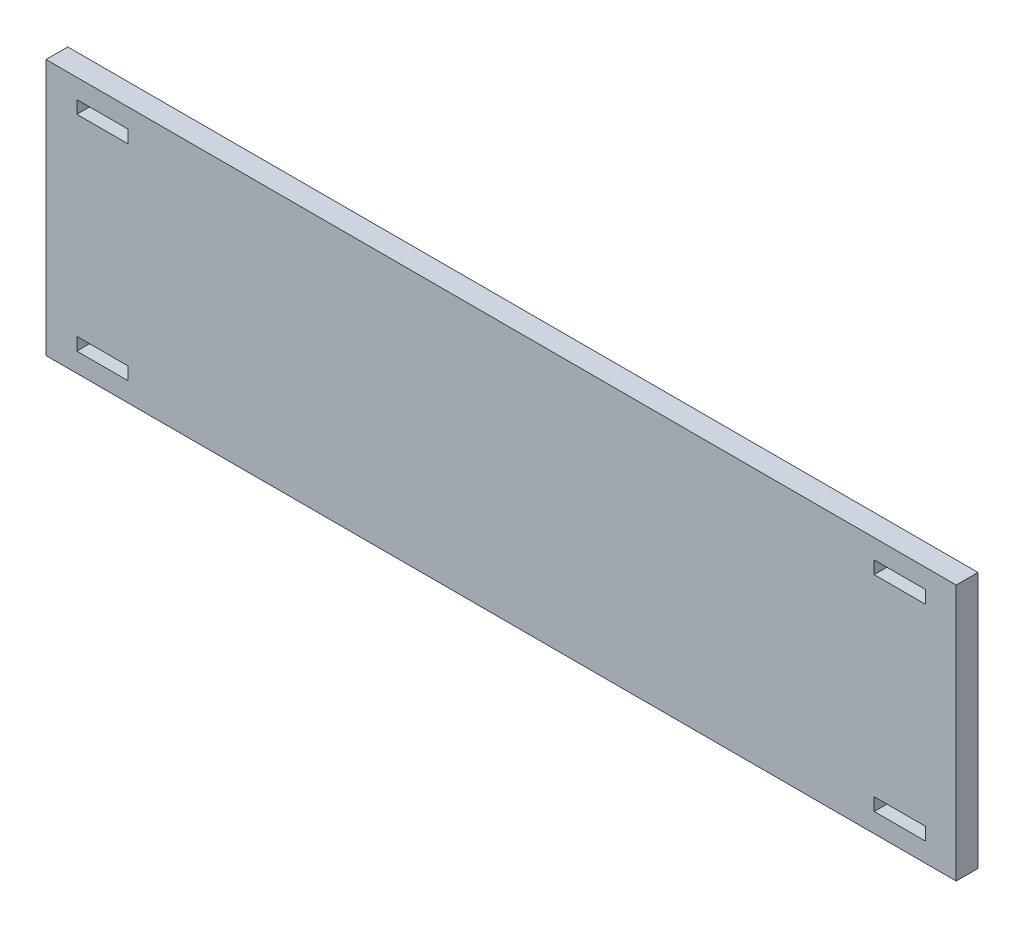
ISO-10303-21;
HEADER;
FILE_DESCRIPTION(('STEP AP214'),'2;1');
FILE_NAME('part.step','',(''),(''),'','','');
FILE_SCHEMA(('AUTOMOTIVE_DESIGN { 1 0 10303 214 1 1 1 1 }'));
ENDSEC;
DATA;
#1=APPLICATION_CONTEXT('core data for automotive mechanical design processes');
#2=APPLICATION_PROTOCOL_DEFINITION('international standard','automotive_design',2000,#1);
#3=PRODUCT_CONTEXT('',#1,'mechanical');
#4=PRODUCT('Part','Part','',(#3));
#5=PRODUCT_RELATED_PRODUCT_CATEGORY('part','',(#4));
#6=PRODUCT_DEFINITION_FORMATION('','',#4);
#7=PRODUCT_DEFINITION_CONTEXT('part definition',#1,'design');
#8=PRODUCT_DEFINITION('design','',#6,#7);
#9=PRODUCT_DEFINITION_SHAPE('','',#8);
#10=(LENGTH_UNIT() NAMED_UNIT(*) SI_UNIT(.MILLI.,.METRE.));
#11=(NAMED_UNIT(*) PLANE_ANGLE_UNIT() SI_UNIT($,.RADIAN.));
#12=(NAMED_UNIT(*) SI_UNIT($,.STERADIAN.) SOLID_ANGLE_UNIT());
#13=UNCERTAINTY_MEASURE_WITH_UNIT(LENGTH_MEASURE(1.E-05),#10,'distance_accuracy_value','');
#14=(GEOMETRIC_REPRESENTATION_CONTEXT(3) GLOBAL_UNCERTAINTY_ASSIGNED_CONTEXT((#13)) GLOBAL_UNIT_ASSIGNED_CONTEXT((#10,
#11,#12)) REPRESENTATION_CONTEXT('',''));
#15=CARTESIAN_POINT('',(0.,0.,0.));
#16=DIRECTION('',(0.,0.,1.));
#17=DIRECTION('',(1.,0.,0.));
#18=AXIS2_PLACEMENT_3D('',#15,#16,#17);
#19=CARTESIAN_POINT('',(177.5,50.,8.5));
#20=DIRECTION('',(-1.,0.,0.));
#21=DIRECTION('',(0.,0.,1.));
#22=AXIS2_PLACEMENT_3D('',#19,#20,#21);
#23=PLANE('',#22);
#24=DIRECTION('',(0.,1.,0.));
#25=VECTOR('',#24,1.);
#26=CARTESIAN_POINT('',(177.5,50.,0.));
#27=LINE('',#26,#25);
#28=CARTESIAN_POINT('',(177.5,-50.,0.));
#29=VERTEX_POINT('',#28);
#30=CARTESIAN_POINT('',(177.5,50.,0.));
#31=VERTEX_POINT('',#30);
#32=EDGE_CURVE('E347',#29,#31,#27,.T.);
#33=ORIENTED_EDGE('',*,*,#32,.T.);
#34=DIRECTION('',(0.,0.,-1.));
#35=VECTOR('',#34,1.);
#36=CARTESIAN_POINT('',(177.5,50.,8.5));
#37=LINE('',#36,#35);
#38=CARTESIAN_POINT('',(177.5,50.,8.5));
#39=VERTEX_POINT('',#38);
#40=EDGE_CURVE('E11',#39,#31,#37,.T.);
#41=ORIENTED_EDGE('',*,*,#40,.F.);
#42=DIRECTION('',(0.,1.,0.));
#43=VECTOR('',#42,1.);
#44=CARTESIAN_POINT('',(177.5,50.,8.5));
#45=LINE('',#44,#43);
#46=CARTESIAN_POINT('',(177.5,-50.,8.5));
#47=VERTEX_POINT('',#46);
#48=EDGE_CURVE('E357',#47,#39,#45,.T.);
#49=ORIENTED_EDGE('',*,*,#48,.F.);
#50=DIRECTION('',(0.,0.,-1.));
#51=VECTOR('',#50,1.);
#52=CARTESIAN_POINT('',(177.5,-50.,8.5));
#53=LINE('',#52,#51);
#54=EDGE_CURVE('E371',#47,#29,#53,.T.);
#55=ORIENTED_EDGE('',*,*,#54,.T.);
#56=EDGE_LOOP('',(#33,#41,#49,#55));
#57=FACE_BOUND('',#56,.T.);
#58=ADVANCED_FACE('F44',(#57),#23,.F.);
#59=CARTESIAN_POINT('',(-177.5,50.,8.5));
#60=DIRECTION('',(0.,-1.,0.));
#61=DIRECTION('',(1.,0.,0.));
#62=AXIS2_PLACEMENT_3D('',#59,#60,#61);
#63=PLANE('',#62);
#64=DIRECTION('',(-1.,0.,0.));
#65=VECTOR('',#64,1.);
#66=CARTESIAN_POINT('',(-177.5,50.,0.));
#67=LINE('',#66,#65);
#68=CARTESIAN_POINT('',(-177.5,50.,0.));
#69=VERTEX_POINT('',#68);
#70=EDGE_CURVE('E375',#31,#69,#67,.T.);
#71=ORIENTED_EDGE('',*,*,#70,.T.);
#72=DIRECTION('',(0.,0.,-1.));
#73=VECTOR('',#72,1.);
#74=CARTESIAN_POINT('',(-177.5,50.,8.5));
#75=LINE('',#74,#73);
#76=CARTESIAN_POINT('',(-177.5,50.,8.5));
#77=VERTEX_POINT('',#76);
#78=EDGE_CURVE('E52',#77,#69,#75,.T.);
#79=ORIENTED_EDGE('',*,*,#78,.F.);
#80=DIRECTION('',(-1.,0.,0.));
#81=VECTOR('',#80,1.);
#82=CARTESIAN_POINT('',(-177.5,50.,8.5));
#83=LINE('',#82,#81);
#84=EDGE_CURVE('E361',#39,#77,#83,.T.);
#85=ORIENTED_EDGE('',*,*,#84,.F.);
#86=ORIENTED_EDGE('',*,*,#40,.T.);
#87=EDGE_LOOP('',(#71,#79,#85,#86));
#88=FACE_BOUND('',#87,.T.);
#89=ADVANCED_FACE('F410',(#88),#63,.F.);
#90=CARTESIAN_POINT('',(-177.5,50.,8.5));
#91=DIRECTION('',(1.,0.,0.));
#92=DIRECTION('',(0.,0.,-1.));
#93=AXIS2_PLACEMENT_3D('',#90,#91,#92);
#94=PLANE('',#93);
#95=DIRECTION('',(0.,-1.,0.));
#96=VECTOR('',#95,1.);
#97=CARTESIAN_POINT('',(-177.5,50.,0.));
#98=LINE('',#97,#96);
#99=CARTESIAN_POINT('',(-177.5,-50.0000000000001,0.));
#100=VERTEX_POINT('',#99);
#101=EDGE_CURVE('E378',#69,#100,#98,.T.);
#102=ORIENTED_EDGE('',*,*,#101,.T.);
#103=DIRECTION('',(0.,0.,-1.));
#104=VECTOR('',#103,1.);
#105=CARTESIAN_POINT('',(-177.5,-50.0000000000001,8.5));
#106=LINE('',#105,#104);
#107=CARTESIAN_POINT('',(-177.5,-50.0000000000001,8.5));
#108=VERTEX_POINT('',#107);
#109=EDGE_CURVE('E386',#108,#100,#106,.T.);
#110=ORIENTED_EDGE('',*,*,#109,.F.);
#111=DIRECTION('',(0.,-1.,0.));
#112=VECTOR('',#111,1.);
#113=CARTESIAN_POINT('',(-177.5,50.,8.5));
#114=LINE('',#113,#112);
#115=EDGE_CURVE('E365',#77,#108,#114,.T.);
#116=ORIENTED_EDGE('',*,*,#115,.F.);
#117=ORIENTED_EDGE('',*,*,#78,.T.);
#118=EDGE_LOOP('',(#102,#110,#116,#117));
#119=FACE_BOUND('',#118,.T.);
#120=ADVANCED_FACE('F395',(#119),#94,.F.);
#121=CARTESIAN_POINT('',(-177.5,-50.0000000000001,8.5));
#122=DIRECTION('',(0.,1.,0.));
#123=DIRECTION('',(-1.,0.,0.));
#124=AXIS2_PLACEMENT_3D('',#121,#122,#123);
#125=PLANE('',#124);
#126=DIRECTION('',(1.,0.,0.));
#127=VECTOR('',#126,1.);
#128=CARTESIAN_POINT('',(-177.5,-50.0000000000001,0.));
#129=LINE('',#128,#127);
#130=EDGE_CURVE('E362',#100,#29,#129,.T.);
#131=ORIENTED_EDGE('',*,*,#130,.T.);
#132=ORIENTED_EDGE('',*,*,#54,.F.);
#133=DIRECTION('',(1.,0.,0.));
#134=VECTOR('',#133,1.);
#135=CARTESIAN_POINT('',(-177.5,-50.0000000000001,8.5));
#136=LINE('',#135,#134);
#137=EDGE_CURVE('E368',#108,#47,#136,.T.);
#138=ORIENTED_EDGE('',*,*,#137,.F.);
#139=ORIENTED_EDGE('',*,*,#109,.T.);
#140=EDGE_LOOP('',(#131,#132,#138,#139));
#141=FACE_BOUND('',#140,.T.);
#142=ADVANCED_FACE('F404',(#141),#125,.F.);
#143=CARTESIAN_POINT('',(0.,0.,8.5));
#144=DIRECTION('',(0.,0.,1.));
#145=DIRECTION('',(1.,0.,0.));
#146=AXIS2_PLACEMENT_3D('',#143,#144,#145);
#147=PLANE('',#146);
#148=DIRECTION('',(0.,1.,0.));
#149=VECTOR('',#148,1.);
#150=CARTESIAN_POINT('',(-145.5,-37.5,8.5));
#151=LINE('',#150,#149);
#152=CARTESIAN_POINT('',(-145.5,-42.5,8.5));
#153=VERTEX_POINT('',#152);
#154=CARTESIAN_POINT('',(-145.5,-37.5,8.5));
#155=VERTEX_POINT('',#154);
#156=EDGE_CURVE('E59',#153,#155,#151,.T.);
#157=ORIENTED_EDGE('',*,*,#156,.F.);
#158=DIRECTION('',(1.,0.,0.));
#159=VECTOR('',#158,1.);
#160=CARTESIAN_POINT('',(-165.5,-42.5,8.5));
#161=LINE('',#160,#159);
#162=CARTESIAN_POINT('',(-165.5,-42.5,8.5));
#163=VERTEX_POINT('',#162);
#164=EDGE_CURVE('E245',#163,#153,#161,.T.);
#165=ORIENTED_EDGE('',*,*,#164,.F.);
#166=DIRECTION('',(0.,-1.,0.));
#167=VECTOR('',#166,1.);
#168=CARTESIAN_POINT('',(-165.5,-37.5,8.5));
#169=LINE('',#168,#167);
#170=CARTESIAN_POINT('',(-165.5,-37.5,8.5));
#171=VERTEX_POINT('',#170);
#172=EDGE_CURVE('E249',#171,#163,#169,.T.);
#173=ORIENTED_EDGE('',*,*,#172,.F.);
#174=DIRECTION('',(-1.,0.,0.));
#175=VECTOR('',#174,1.);
#176=CARTESIAN_POINT('',(-165.5,-37.5,8.5));
#177=LINE('',#176,#175);
#178=EDGE_CURVE('E254',#155,#171,#177,.T.);
#179=ORIENTED_EDGE('',*,*,#178,.F.);
#180=EDGE_LOOP('',(#157,#165,#173,#179));
#181=FACE_BOUND('',#180,.T.);
#182=DIRECTION('',(0.,1.,0.));
#183=VECTOR('',#182,1.);
#184=CARTESIAN_POINT('',(165.5,42.5,8.5));
#185=LINE('',#184,#183);
#186=CARTESIAN_POINT('',(165.5,37.5,8.5));
#187=VERTEX_POINT('',#186);
#188=CARTESIAN_POINT('',(165.5,42.5,8.5));
#189=VERTEX_POINT('',#188);
#190=EDGE_CURVE('E67',#187,#189,#185,.T.);
#191=ORIENTED_EDGE('',*,*,#190,.F.);
#192=DIRECTION('',(1.,0.,0.));
#193=VECTOR('',#192,1.);
#194=CARTESIAN_POINT('',(145.5,37.5,8.5));
#195=LINE('',#194,#193);
#196=CARTESIAN_POINT('',(145.5,37.5,8.5));
#197=VERTEX_POINT('',#196);
#198=EDGE_CURVE('E284',#197,#187,#195,.T.);
#199=ORIENTED_EDGE('',*,*,#198,.F.);
#200=DIRECTION('',(0.,-1.,0.));
#201=VECTOR('',#200,1.);
#202=CARTESIAN_POINT('',(145.5,42.5,8.5));
#203=LINE('',#202,#201);
#204=CARTESIAN_POINT('',(145.5,42.5,8.5));
#205=VERTEX_POINT('',#204);
#206=EDGE_CURVE('E288',#205,#197,#203,.T.);
#207=ORIENTED_EDGE('',*,*,#206,.F.);
#208=DIRECTION('',(-1.,0.,0.));
#209=VECTOR('',#208,1.);
#210=CARTESIAN_POINT('',(145.5,42.5,8.5));
#211=LINE('',#210,#209);
#212=EDGE_CURVE('E293',#189,#205,#211,.T.);
#213=ORIENTED_EDGE('',*,*,#212,.F.);
#214=EDGE_LOOP('',(#191,#199,#207,#213));
#215=FACE_BOUND('',#214,.T.);
#216=DIRECTION('',(0.,1.,0.));
#217=VECTOR('',#216,1.);
#218=CARTESIAN_POINT('',(165.5,-37.5,8.5));
#219=LINE('',#218,#217);
#220=CARTESIAN_POINT('',(165.5,-42.5,8.5));
#221=VERTEX_POINT('',#220);
#222=CARTESIAN_POINT('',(165.5,-37.5,8.5));
#223=VERTEX_POINT('',#222);
#224=EDGE_CURVE('E184',#221,#223,#219,.T.);
#225=ORIENTED_EDGE('',*,*,#224,.F.);
#226=DIRECTION('',(1.,0.,0.));
#227=VECTOR('',#226,1.);
#228=CARTESIAN_POINT('',(145.5,-42.5,8.5));
#229=LINE('',#228,#227);
#230=CARTESIAN_POINT('',(145.5,-42.5,8.5));
#231=VERTEX_POINT('',#230);
#232=EDGE_CURVE('E195',#231,#221,#229,.T.);
#233=ORIENTED_EDGE('',*,*,#232,.F.);
#234=DIRECTION('',(0.,-1.,0.));
#235=VECTOR('',#234,1.);
#236=CARTESIAN_POINT('',(145.5,-37.5,8.5));
#237=LINE('',#236,#235);
#238=CARTESIAN_POINT('',(145.5,-37.5,8.5));
#239=VERTEX_POINT('',#238);
#240=EDGE_CURVE('E201',#239,#231,#237,.T.);
#241=ORIENTED_EDGE('',*,*,#240,.F.);
#242=DIRECTION('',(-1.,0.,0.));
#243=VECTOR('',#242,1.);
#244=CARTESIAN_POINT('',(145.5,-37.5,8.5));
#245=LINE('',#244,#243);
#246=EDGE_CURVE('E207',#223,#239,#245,.T.);
#247=ORIENTED_EDGE('',*,*,#246,.F.);
#248=EDGE_LOOP('',(#225,#233,#241,#247));
#249=FACE_BOUND('',#248,.T.);
#250=DIRECTION('',(0.,1.,0.));
#251=VECTOR('',#250,1.);
#252=CARTESIAN_POINT('',(-145.5,42.5,8.5));
#253=LINE('',#252,#251);
#254=CARTESIAN_POINT('',(-145.5,37.5,8.5));
#255=VERTEX_POINT('',#254);
#256=CARTESIAN_POINT('',(-145.5,42.5,8.5));
#257=VERTEX_POINT('',#256);
#258=EDGE_CURVE('E260',#255,#257,#253,.T.);
#259=ORIENTED_EDGE('',*,*,#258,.F.);
#260=DIRECTION('',(1.,0.,0.));
#261=VECTOR('',#260,1.);
#262=CARTESIAN_POINT('',(-165.5,37.5,8.5));
#263=LINE('',#262,#261);
#264=CARTESIAN_POINT('',(-165.5,37.5,8.5));
#265=VERTEX_POINT('',#264);
#266=EDGE_CURVE('E318',#265,#255,#263,.T.);
#267=ORIENTED_EDGE('',*,*,#266,.F.);
#268=DIRECTION('',(0.,-1.,0.));
#269=VECTOR('',#268,1.);
#270=CARTESIAN_POINT('',(-165.5,42.5,8.5));
#271=LINE('',#270,#269);
#272=CARTESIAN_POINT('',(-165.5,42.5,8.5));
#273=VERTEX_POINT('',#272);
#274=EDGE_CURVE('E337',#273,#265,#271,.T.);
#275=ORIENTED_EDGE('',*,*,#274,.F.);
#276=DIRECTION('',(-1.,0.,0.));
#277=VECTOR('',#276,1.);
#278=CARTESIAN_POINT('',(-165.5,42.5,8.5));
#279=LINE('',#278,#277);
#280=EDGE_CURVE('E333',#257,#273,#279,.T.);
#281=ORIENTED_EDGE('',*,*,#280,.F.);
#282=EDGE_LOOP('',(#259,#267,#275,#281));
#283=FACE_BOUND('',#282,.T.);
#284=ORIENTED_EDGE('',*,*,#48,.T.);
#285=ORIENTED_EDGE('',*,*,#84,.T.);
#286=ORIENTED_EDGE('',*,*,#115,.T.);
#287=ORIENTED_EDGE('',*,*,#137,.T.);
#288=EDGE_LOOP('',(#284,#285,#286,#287));
#289=FACE_BOUND('',#288,.T.);
#290=ADVANCED_FACE('F204',(#181,#215,#249,#283,#289),#147,.T.);
#291=CARTESIAN_POINT('',(0.,0.,0.));
#292=DIRECTION('',(0.,0.,1.));
#293=DIRECTION('',(1.,0.,0.));
#294=AXIS2_PLACEMENT_3D('',#291,#292,#293);
#295=PLANE('',#294);
#296=ORIENTED_EDGE('',*,*,#32,.F.);
#297=ORIENTED_EDGE('',*,*,#130,.F.);
#298=ORIENTED_EDGE('',*,*,#101,.F.);
#299=ORIENTED_EDGE('',*,*,#70,.F.);
#300=EDGE_LOOP('',(#296,#297,#298,#299));
#301=FACE_BOUND('',#300,.T.);
#302=ADVANCED_FACE('F401',(#301),#295,.F.);
#303=CARTESIAN_POINT('',(-145.5,42.5,2.));
#304=DIRECTION('',(1.,0.,0.));
#305=DIRECTION('',(0.,0.,-1.));
#306=AXIS2_PLACEMENT_3D('',#303,#304,#305);
#307=PLANE('',#306);
#308=ORIENTED_EDGE('',*,*,#258,.T.);
#309=DIRECTION('',(0.,0.,1.));
#310=VECTOR('',#309,1.);
#311=CARTESIAN_POINT('',(-145.5,42.5,2.));
#312=LINE('',#311,#310);
#313=CARTESIAN_POINT('',(-145.5,42.5,2.));
#314=VERTEX_POINT('',#313);
#315=EDGE_CURVE('E330',#314,#257,#312,.T.);
#316=ORIENTED_EDGE('',*,*,#315,.F.);
#317=DIRECTION('',(0.,1.,0.));
#318=VECTOR('',#317,1.);
#319=CARTESIAN_POINT('',(-145.5,42.5,2.));
#320=LINE('',#319,#318);
#321=CARTESIAN_POINT('',(-145.5,37.5,2.));
#322=VERTEX_POINT('',#321);
#323=EDGE_CURVE('E313',#322,#314,#320,.T.);
#324=ORIENTED_EDGE('',*,*,#323,.F.);
#325=DIRECTION('',(0.,0.,1.));
#326=VECTOR('',#325,1.);
#327=CARTESIAN_POINT('',(-145.5,37.5,2.));
#328=LINE('',#327,#326);
#329=EDGE_CURVE('E344',#322,#255,#328,.T.);
#330=ORIENTED_EDGE('',*,*,#329,.T.);
#331=EDGE_LOOP('',(#308,#316,#324,#330));
#332=FACE_BOUND('',#331,.T.);
#333=ADVANCED_FACE('F422',(#332),#307,.F.);
#334=CARTESIAN_POINT('',(-165.5,37.5,2.));
#335=DIRECTION('',(0.,-1.,0.));
#336=DIRECTION('',(0.,0.,-1.));
#337=AXIS2_PLACEMENT_3D('',#334,#335,#336);
#338=PLANE('',#337);
#339=ORIENTED_EDGE('',*,*,#266,.T.);
#340=ORIENTED_EDGE('',*,*,#329,.F.);
#341=DIRECTION('',(1.,0.,0.));
#342=VECTOR('',#341,1.);
#343=CARTESIAN_POINT('',(-165.5,37.5,2.));
#344=LINE('',#343,#342);
#345=CARTESIAN_POINT('',(-165.5,37.5,2.));
#346=VERTEX_POINT('',#345);
#347=EDGE_CURVE('E326',#346,#322,#344,.T.);
#348=ORIENTED_EDGE('',*,*,#347,.F.);
#349=DIRECTION('',(0.,0.,1.));
#350=VECTOR('',#349,1.);
#351=CARTESIAN_POINT('',(-165.5,37.5,2.));
#352=LINE('',#351,#350);
#353=EDGE_CURVE('E348',#346,#265,#352,.T.);
#354=ORIENTED_EDGE('',*,*,#353,.T.);
#355=EDGE_LOOP('',(#339,#340,#348,#354));
#356=FACE_BOUND('',#355,.T.);
#357=ADVANCED_FACE('F428',(#356),#338,.F.);
#358=CARTESIAN_POINT('',(-165.5,42.5,2.));
#359=DIRECTION('',(-1.,0.,0.));
#360=DIRECTION('',(0.,0.,1.));
#361=AXIS2_PLACEMENT_3D('',#358,#359,#360);
#362=PLANE('',#361);
#363=ORIENTED_EDGE('',*,*,#274,.T.);
#364=ORIENTED_EDGE('',*,*,#353,.F.);
#365=DIRECTION('',(0.,-1.,0.));
#366=VECTOR('',#365,1.);
#367=CARTESIAN_POINT('',(-165.5,42.5,2.));
#368=LINE('',#367,#366);
#369=CARTESIAN_POINT('',(-165.5,42.5,2.));
#370=VERTEX_POINT('',#369);
#371=EDGE_CURVE('E322',#370,#346,#368,.T.);
#372=ORIENTED_EDGE('',*,*,#371,.F.);
#373=DIRECTION('',(0.,0.,1.));
#374=VECTOR('',#373,1.);
#375=CARTESIAN_POINT('',(-165.5,42.5,2.));
#376=LINE('',#375,#374);
#377=EDGE_CURVE('E351',#370,#273,#376,.T.);
#378=ORIENTED_EDGE('',*,*,#377,.T.);
#379=EDGE_LOOP('',(#363,#364,#372,#378));
#380=FACE_BOUND('',#379,.T.);
#381=ADVANCED_FACE('F434',(#380),#362,.F.);
#382=CARTESIAN_POINT('',(-165.5,42.5,2.));
#383=DIRECTION('',(0.,1.,0.));
#384=DIRECTION('',(0.,0.,1.));
#385=AXIS2_PLACEMENT_3D('',#382,#383,#384);
#386=PLANE('',#385);
#387=ORIENTED_EDGE('',*,*,#280,.T.);
#388=ORIENTED_EDGE('',*,*,#377,.F.);
#389=DIRECTION('',(-1.,0.,0.));
#390=VECTOR('',#389,1.);
#391=CARTESIAN_POINT('',(-165.5,42.5,2.));
#392=LINE('',#391,#390);
#393=EDGE_CURVE('E317',#314,#370,#392,.T.);
#394=ORIENTED_EDGE('',*,*,#393,.F.);
#395=ORIENTED_EDGE('',*,*,#315,.T.);
#396=EDGE_LOOP('',(#387,#388,#394,#395));
#397=FACE_BOUND('',#396,.T.);
#398=ADVANCED_FACE('F430',(#397),#386,.F.);
#399=CARTESIAN_POINT('',(0.,0.,2.));
#400=DIRECTION('',(0.,0.,1.));
#401=DIRECTION('',(1.,0.,0.));
#402=AXIS2_PLACEMENT_3D('',#399,#400,#401);
#403=PLANE('',#402);
#404=ORIENTED_EDGE('',*,*,#323,.T.);
#405=ORIENTED_EDGE('',*,*,#393,.T.);
#406=ORIENTED_EDGE('',*,*,#371,.T.);
#407=ORIENTED_EDGE('',*,*,#347,.T.);
#408=EDGE_LOOP('',(#404,#405,#406,#407));
#409=FACE_BOUND('',#408,.T.);
#410=ADVANCED_FACE('F433',(#409),#403,.T.);
#411=CARTESIAN_POINT('',(165.5,-37.5,2.));
#412=DIRECTION('',(1.,0.,0.));
#413=DIRECTION('',(0.,0.,-1.));
#414=AXIS2_PLACEMENT_3D('',#411,#412,#413);
#415=PLANE('',#414);
#416=ORIENTED_EDGE('',*,*,#224,.T.);
#417=DIRECTION('',(0.,0.,1.));
#418=VECTOR('',#417,1.);
#419=CARTESIAN_POINT('',(165.5,-37.5,2.));
#420=LINE('',#419,#418);
#421=CARTESIAN_POINT('',(165.5,-37.5,2.));
#422=VERTEX_POINT('',#421);
#423=EDGE_CURVE('E222',#422,#223,#420,.T.);
#424=ORIENTED_EDGE('',*,*,#423,.F.);
#425=DIRECTION('',(0.,1.,0.));
#426=VECTOR('',#425,1.);
#427=CARTESIAN_POINT('',(165.5,-37.5,2.));
#428=LINE('',#427,#426);
#429=CARTESIAN_POINT('',(165.5,-42.5,2.));
#430=VERTEX_POINT('',#429);
#431=EDGE_CURVE('E187',#430,#422,#428,.T.);
#432=ORIENTED_EDGE('',*,*,#431,.F.);
#433=DIRECTION('',(0.,0.,1.));
#434=VECTOR('',#433,1.);
#435=CARTESIAN_POINT('',(165.5,-42.5,2.));
#436=LINE('',#435,#434);
#437=EDGE_CURVE('E180',#430,#221,#436,.T.);
#438=ORIENTED_EDGE('',*,*,#437,.T.);
#439=EDGE_LOOP('',(#416,#424,#432,#438));
#440=FACE_BOUND('',#439,.T.);
#441=ADVANCED_FACE('F182',(#440),#415,.F.);
#442=CARTESIAN_POINT('',(145.5,-42.5,2.));
#443=DIRECTION('',(0.,-1.,0.));
#444=DIRECTION('',(0.,0.,-1.));
#445=AXIS2_PLACEMENT_3D('',#442,#443,#444);
#446=PLANE('',#445);
#447=ORIENTED_EDGE('',*,*,#232,.T.);
#448=ORIENTED_EDGE('',*,*,#437,.F.);
#449=DIRECTION('',(1.,0.,0.));
#450=VECTOR('',#449,1.);
#451=CARTESIAN_POINT('',(145.5,-42.5,2.));
#452=LINE('',#451,#450);
#453=CARTESIAN_POINT('',(145.5,-42.5,2.));
#454=VERTEX_POINT('',#453);
#455=EDGE_CURVE('E218',#454,#430,#452,.T.);
#456=ORIENTED_EDGE('',*,*,#455,.F.);
#457=DIRECTION('',(0.,0.,1.));
#458=VECTOR('',#457,1.);
#459=CARTESIAN_POINT('',(145.5,-42.5,2.));
#460=LINE('',#459,#458);
#461=EDGE_CURVE('E192',#454,#231,#460,.T.);
#462=ORIENTED_EDGE('',*,*,#461,.T.);
#463=EDGE_LOOP('',(#447,#448,#456,#462));
#464=FACE_BOUND('',#463,.T.);
#465=ADVANCED_FACE('F196',(#464),#446,.F.);
#466=CARTESIAN_POINT('',(145.5,-37.5,2.));
#467=DIRECTION('',(-1.,0.,0.));
#468=DIRECTION('',(0.,0.,1.));
#469=AXIS2_PLACEMENT_3D('',#466,#467,#468);
#470=PLANE('',#469);
#471=ORIENTED_EDGE('',*,*,#240,.T.);
#472=ORIENTED_EDGE('',*,*,#461,.F.);
#473=DIRECTION('',(0.,-1.,0.));
#474=VECTOR('',#473,1.);
#475=CARTESIAN_POINT('',(145.5,-37.5,2.));
#476=LINE('',#475,#474);
#477=CARTESIAN_POINT('',(145.5,-37.5,2.));
#478=VERTEX_POINT('',#477);
#479=EDGE_CURVE('E221',#478,#454,#476,.T.);
#480=ORIENTED_EDGE('',*,*,#479,.F.);
#481=DIRECTION('',(0.,0.,1.));
#482=VECTOR('',#481,1.);
#483=CARTESIAN_POINT('',(145.5,-37.5,2.));
#484=LINE('',#483,#482);
#485=EDGE_CURVE('E707',#478,#239,#484,.T.);
#486=ORIENTED_EDGE('',*,*,#485,.T.);
#487=EDGE_LOOP('',(#471,#472,#480,#486));
#488=FACE_BOUND('',#487,.T.);
#489=ADVANCED_FACE('F490',(#488),#470,.F.);
#490=CARTESIAN_POINT('',(145.5,-37.5,2.));
#491=DIRECTION('',(0.,1.,0.));
#492=DIRECTION('',(0.,0.,1.));
#493=AXIS2_PLACEMENT_3D('',#490,#491,#492);
#494=PLANE('',#493);
#495=ORIENTED_EDGE('',*,*,#246,.T.);
#496=ORIENTED_EDGE('',*,*,#485,.F.);
#497=DIRECTION('',(-1.,0.,0.));
#498=VECTOR('',#497,1.);
#499=CARTESIAN_POINT('',(145.5,-37.5,2.));
#500=LINE('',#499,#498);
#501=EDGE_CURVE('E226',#422,#478,#500,.T.);
#502=ORIENTED_EDGE('',*,*,#501,.F.);
#503=ORIENTED_EDGE('',*,*,#423,.T.);
#504=EDGE_LOOP('',(#495,#496,#502,#503));
#505=FACE_BOUND('',#504,.T.);
#506=ADVANCED_FACE('F486',(#505),#494,.F.);
#507=CARTESIAN_POINT('',(0.,0.,2.));
#508=DIRECTION('',(0.,0.,1.));
#509=DIRECTION('',(1.,0.,0.));
#510=AXIS2_PLACEMENT_3D('',#507,#508,#509);
#511=PLANE('',#510);
#512=ORIENTED_EDGE('',*,*,#431,.T.);
#513=ORIENTED_EDGE('',*,*,#501,.T.);
#514=ORIENTED_EDGE('',*,*,#479,.T.);
#515=ORIENTED_EDGE('',*,*,#455,.T.);
#516=EDGE_LOOP('',(#512,#513,#514,#515));
#517=FACE_BOUND('',#516,.T.);
#518=ADVANCED_FACE('F465',(#517),#511,.T.);
#519=CARTESIAN_POINT('',(165.5,42.5,2.));
#520=DIRECTION('',(1.,0.,0.));
#521=DIRECTION('',(0.,0.,-1.));
#522=AXIS2_PLACEMENT_3D('',#519,#520,#521);
#523=PLANE('',#522);
#524=ORIENTED_EDGE('',*,*,#190,.T.);
#525=DIRECTION('',(0.,0.,1.));
#526=VECTOR('',#525,1.);
#527=CARTESIAN_POINT('',(165.5,42.5,2.));
#528=LINE('',#527,#526);
#529=CARTESIAN_POINT('',(165.5,42.5,2.));
#530=VERTEX_POINT('',#529);
#531=EDGE_CURVE('E275',#530,#189,#528,.T.);
#532=ORIENTED_EDGE('',*,*,#531,.F.);
#533=DIRECTION('',(0.,1.,0.));
#534=VECTOR('',#533,1.);
#535=CARTESIAN_POINT('',(165.5,42.5,2.));
#536=LINE('',#535,#534);
#537=CARTESIAN_POINT('',(165.5,37.5,2.));
#538=VERTEX_POINT('',#537);
#539=EDGE_CURVE('E289',#538,#530,#536,.T.);
#540=ORIENTED_EDGE('',*,*,#539,.F.);
#541=DIRECTION('',(0.,0.,1.));
#542=VECTOR('',#541,1.);
#543=CARTESIAN_POINT('',(165.5,37.5,2.));
#544=LINE('',#543,#542);
#545=EDGE_CURVE('E209',#538,#187,#544,.T.);
#546=ORIENTED_EDGE('',*,*,#545,.T.);
#547=EDGE_LOOP('',(#524,#532,#540,#546));
#548=FACE_BOUND('',#547,.T.);
#549=ADVANCED_FACE('F455',(#548),#523,.F.);
#550=CARTESIAN_POINT('',(145.5,37.5,2.));
#551=DIRECTION('',(0.,-1.,0.));
#552=DIRECTION('',(0.,0.,-1.));
#553=AXIS2_PLACEMENT_3D('',#550,#551,#552);
#554=PLANE('',#553);
#555=ORIENTED_EDGE('',*,*,#198,.T.);
#556=ORIENTED_EDGE('',*,*,#545,.F.);
#557=DIRECTION('',(1.,0.,0.));
#558=VECTOR('',#557,1.);
#559=CARTESIAN_POINT('',(145.5,37.5,2.));
#560=LINE('',#559,#558);
#561=CARTESIAN_POINT('',(145.5,37.5,2.));
#562=VERTEX_POINT('',#561);
#563=EDGE_CURVE('E278',#562,#538,#560,.T.);
#564=ORIENTED_EDGE('',*,*,#563,.F.);
#565=DIRECTION('',(0.,0.,1.));
#566=VECTOR('',#565,1.);
#567=CARTESIAN_POINT('',(145.5,37.5,2.));
#568=LINE('',#567,#566);
#569=EDGE_CURVE('E213',#562,#197,#568,.T.);
#570=ORIENTED_EDGE('',*,*,#569,.T.);
#571=EDGE_LOOP('',(#555,#556,#564,#570));
#572=FACE_BOUND('',#571,.T.);
#573=ADVANCED_FACE('F451',(#572),#554,.F.);
#574=CARTESIAN_POINT('',(145.5,42.5,2.));
#575=DIRECTION('',(-1.,0.,0.));
#576=DIRECTION('',(0.,0.,1.));
#577=AXIS2_PLACEMENT_3D('',#574,#575,#576);
#578=PLANE('',#577);
#579=ORIENTED_EDGE('',*,*,#206,.T.);
#580=ORIENTED_EDGE('',*,*,#569,.F.);
#581=DIRECTION('',(0.,-1.,0.));
#582=VECTOR('',#581,1.);
#583=CARTESIAN_POINT('',(145.5,42.5,2.));
#584=LINE('',#583,#582);
#585=CARTESIAN_POINT('',(145.5,42.5,2.));
#586=VERTEX_POINT('',#585);
#587=EDGE_CURVE('E302',#586,#562,#584,.T.);
#588=ORIENTED_EDGE('',*,*,#587,.F.);
#589=DIRECTION('',(0.,0.,1.));
#590=VECTOR('',#589,1.);
#591=CARTESIAN_POINT('',(145.5,42.5,2.));
#592=LINE('',#591,#590);
#593=EDGE_CURVE('E279',#586,#205,#592,.T.);
#594=ORIENTED_EDGE('',*,*,#593,.T.);
#595=EDGE_LOOP('',(#579,#580,#588,#594));
#596=FACE_BOUND('',#595,.T.);
#597=ADVANCED_FACE('F454',(#596),#578,.F.);
#598=CARTESIAN_POINT('',(145.5,42.5,2.));
#599=DIRECTION('',(0.,1.,0.));
#600=DIRECTION('',(0.,0.,1.));
#601=AXIS2_PLACEMENT_3D('',#598,#599,#600);
#602=PLANE('',#601);
#603=ORIENTED_EDGE('',*,*,#212,.T.);
#604=ORIENTED_EDGE('',*,*,#593,.F.);
#605=DIRECTION('',(-1.,0.,0.));
#606=VECTOR('',#605,1.);
#607=CARTESIAN_POINT('',(145.5,42.5,2.));
#608=LINE('',#607,#606);
#609=EDGE_CURVE('E306',#530,#586,#608,.T.);
#610=ORIENTED_EDGE('',*,*,#609,.F.);
#611=ORIENTED_EDGE('',*,*,#531,.T.);
#612=EDGE_LOOP('',(#603,#604,#610,#611));
#613=FACE_BOUND('',#612,.T.);
#614=ADVANCED_FACE('F449',(#613),#602,.F.);
#615=CARTESIAN_POINT('',(0.,0.,2.));
#616=DIRECTION('',(0.,0.,1.));
#617=DIRECTION('',(1.,0.,0.));
#618=AXIS2_PLACEMENT_3D('',#615,#616,#617);
#619=PLANE('',#618);
#620=ORIENTED_EDGE('',*,*,#539,.T.);
#621=ORIENTED_EDGE('',*,*,#609,.T.);
#622=ORIENTED_EDGE('',*,*,#587,.T.);
#623=ORIENTED_EDGE('',*,*,#563,.T.);
#624=EDGE_LOOP('',(#620,#621,#622,#623));
#625=FACE_BOUND('',#624,.T.);
#626=ADVANCED_FACE('F445',(#625),#619,.T.);
#627=CARTESIAN_POINT('',(-145.5,-37.5,2.));
#628=DIRECTION('',(1.,0.,0.));
#629=DIRECTION('',(0.,0.,-1.));
#630=AXIS2_PLACEMENT_3D('',#627,#628,#629);
#631=PLANE('',#630);
#632=ORIENTED_EDGE('',*,*,#156,.T.);
#633=DIRECTION('',(0.,0.,1.));
#634=VECTOR('',#633,1.);
#635=CARTESIAN_POINT('',(-145.5,-37.5,2.));
#636=LINE('',#635,#634);
#637=CARTESIAN_POINT('',(-145.5,-37.5,2.));
#638=VERTEX_POINT('',#637);
#639=EDGE_CURVE('E232',#638,#155,#636,.T.);
#640=ORIENTED_EDGE('',*,*,#639,.F.);
#641=DIRECTION('',(0.,1.,0.));
#642=VECTOR('',#641,1.);
#643=CARTESIAN_POINT('',(-145.5,-37.5,2.));
#644=LINE('',#643,#642);
#645=CARTESIAN_POINT('',(-145.5,-42.5,2.));
#646=VERTEX_POINT('',#645);
#647=EDGE_CURVE('E250',#646,#638,#644,.T.);
#648=ORIENTED_EDGE('',*,*,#647,.F.);
#649=DIRECTION('',(0.,0.,1.));
#650=VECTOR('',#649,1.);
#651=CARTESIAN_POINT('',(-145.5,-42.5,2.));
#652=LINE('',#651,#650);
#653=EDGE_CURVE('E242',#646,#153,#652,.T.);
#654=ORIENTED_EDGE('',*,*,#653,.T.);
#655=EDGE_LOOP('',(#632,#640,#648,#654));
#656=FACE_BOUND('',#655,.T.);
#657=ADVANCED_FACE('F448',(#656),#631,.F.);
#658=CARTESIAN_POINT('',(-165.5,-42.5,2.));
#659=DIRECTION('',(0.,-1.,0.));
#660=DIRECTION('',(0.,0.,-1.));
#661=AXIS2_PLACEMENT_3D('',#658,#659,#660);
#662=PLANE('',#661);
#663=ORIENTED_EDGE('',*,*,#164,.T.);
#664=ORIENTED_EDGE('',*,*,#653,.F.);
#665=DIRECTION('',(1.,0.,0.));
#666=VECTOR('',#665,1.);
#667=CARTESIAN_POINT('',(-165.5,-42.5,2.));
#668=LINE('',#667,#666);
#669=CARTESIAN_POINT('',(-165.5,-42.5,2.));
#670=VERTEX_POINT('',#669);
#671=EDGE_CURVE('E235',#670,#646,#668,.T.);
#672=ORIENTED_EDGE('',*,*,#671,.F.);
#673=DIRECTION('',(0.,0.,1.));
#674=VECTOR('',#673,1.);
#675=CARTESIAN_POINT('',(-165.5,-42.5,2.));
#676=LINE('',#675,#674);
#677=EDGE_CURVE('E239',#670,#163,#676,.T.);
#678=ORIENTED_EDGE('',*,*,#677,.T.);
#679=EDGE_LOOP('',(#663,#664,#672,#678));
#680=FACE_BOUND('',#679,.T.);
#681=ADVANCED_FACE('F471',(#680),#662,.F.);
#682=CARTESIAN_POINT('',(-165.5,-37.5,2.));
#683=DIRECTION('',(-1.,0.,0.));
#684=DIRECTION('',(0.,0.,1.));
#685=AXIS2_PLACEMENT_3D('',#682,#683,#684);
#686=PLANE('',#685);
#687=ORIENTED_EDGE('',*,*,#172,.T.);
#688=ORIENTED_EDGE('',*,*,#677,.F.);
#689=DIRECTION('',(0.,-1.,0.));
#690=VECTOR('',#689,1.);
#691=CARTESIAN_POINT('',(-165.5,-37.5,2.));
#692=LINE('',#691,#690);
#693=CARTESIAN_POINT('',(-165.5,-37.5,2.));
#694=VERTEX_POINT('',#693);
#695=EDGE_CURVE('E264',#694,#670,#692,.T.);
#696=ORIENTED_EDGE('',*,*,#695,.F.);
#697=DIRECTION('',(0.,0.,1.));
#698=VECTOR('',#697,1.);
#699=CARTESIAN_POINT('',(-165.5,-37.5,2.));
#700=LINE('',#699,#698);
#701=EDGE_CURVE('E236',#694,#171,#700,.T.);
#702=ORIENTED_EDGE('',*,*,#701,.T.);
#703=EDGE_LOOP('',(#687,#688,#696,#702));
#704=FACE_BOUND('',#703,.T.);
#705=ADVANCED_FACE('F474',(#704),#686,.F.);
#706=CARTESIAN_POINT('',(-165.5,-37.5,2.));
#707=DIRECTION('',(0.,1.,0.));
#708=DIRECTION('',(0.,0.,1.));
#709=AXIS2_PLACEMENT_3D('',#706,#707,#708);
#710=PLANE('',#709);
#711=ORIENTED_EDGE('',*,*,#178,.T.);
#712=ORIENTED_EDGE('',*,*,#701,.F.);
#713=DIRECTION('',(-1.,0.,0.));
#714=VECTOR('',#713,1.);
#715=CARTESIAN_POINT('',(-165.5,-37.5,2.));
#716=LINE('',#715,#714);
#717=EDGE_CURVE('E268',#638,#694,#716,.T.);
#718=ORIENTED_EDGE('',*,*,#717,.F.);
#719=ORIENTED_EDGE('',*,*,#639,.T.);
#720=EDGE_LOOP('',(#711,#712,#718,#719));
#721=FACE_BOUND('',#720,.T.);
#722=ADVANCED_FACE('F469',(#721),#710,.F.);
#723=CARTESIAN_POINT('',(0.,0.,2.));
#724=DIRECTION('',(0.,0.,1.));
#725=DIRECTION('',(1.,0.,0.));
#726=AXIS2_PLACEMENT_3D('',#723,#724,#725);
#727=PLANE('',#726);
#728=ORIENTED_EDGE('',*,*,#647,.T.);
#729=ORIENTED_EDGE('',*,*,#717,.T.);
#730=ORIENTED_EDGE('',*,*,#695,.T.);
#731=ORIENTED_EDGE('',*,*,#671,.T.);
#732=EDGE_LOOP('',(#728,#729,#730,#731));
#733=FACE_BOUND('',#732,.T.);
#734=ADVANCED_FACE('F466',(#733),#727,.T.);
#735=CLOSED_SHELL('',(#58,#89,#120,#142,#290,#302,#333,#357,#381,#398,#410,#441,#465,#489,#506,
#518,#549,#573,#597,#614,#626,#657,#681,#705,#722,#734));
#736=MANIFOLD_SOLID_BREP('B2',#735);
#737=ADVANCED_BREP_SHAPE_REPRESENTATION('',(#18,#736),#14);
#738=SHAPE_DEFINITION_REPRESENTATION(#9,#737);
ENDSEC;
END-ISO-10303-21;
